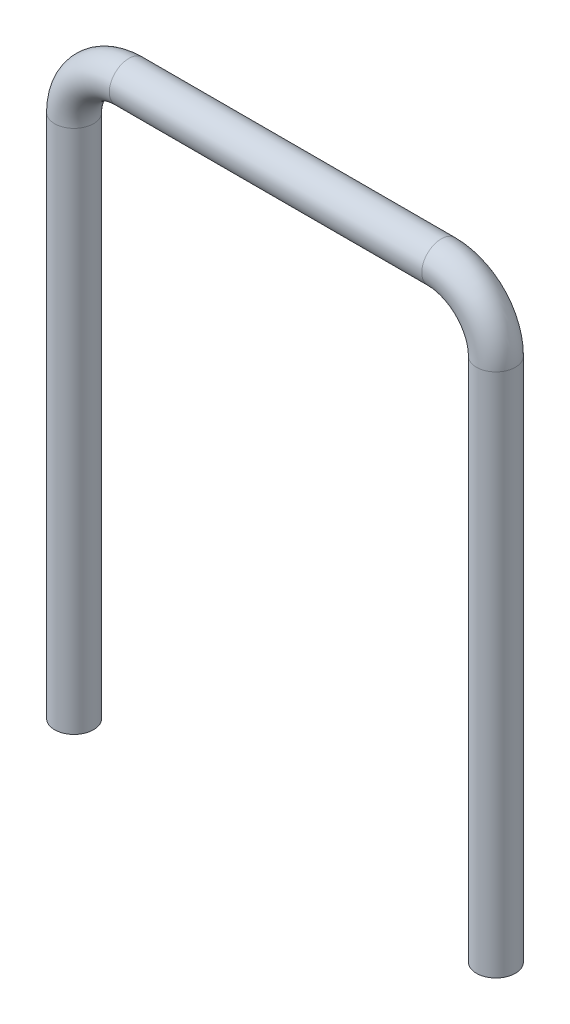
ISO-10303-21;
HEADER;
FILE_DESCRIPTION(('STEP AP214'),'2;1');
FILE_NAME('part.step','',(''),(''),'','','');
FILE_SCHEMA(('AUTOMOTIVE_DESIGN { 1 0 10303 214 1 1 1 1 }'));
ENDSEC;
DATA;
#1=APPLICATION_CONTEXT('core data for automotive mechanical design processes');
#2=APPLICATION_PROTOCOL_DEFINITION('international standard','automotive_design',2000,#1);
#3=PRODUCT_CONTEXT('',#1,'mechanical');
#4=PRODUCT('Part','Part','',(#3));
#5=PRODUCT_RELATED_PRODUCT_CATEGORY('part','',(#4));
#6=PRODUCT_DEFINITION_FORMATION('','',#4);
#7=PRODUCT_DEFINITION_CONTEXT('part definition',#1,'design');
#8=PRODUCT_DEFINITION('design','',#6,#7);
#9=PRODUCT_DEFINITION_SHAPE('','',#8);
#10=(LENGTH_UNIT() NAMED_UNIT(*) SI_UNIT(.MILLI.,.METRE.));
#11=(NAMED_UNIT(*) PLANE_ANGLE_UNIT() SI_UNIT($,.RADIAN.));
#12=(NAMED_UNIT(*) SI_UNIT($,.STERADIAN.) SOLID_ANGLE_UNIT());
#13=UNCERTAINTY_MEASURE_WITH_UNIT(LENGTH_MEASURE(1.E-05),#10,'distance_accuracy_value','');
#14=(GEOMETRIC_REPRESENTATION_CONTEXT(3) GLOBAL_UNCERTAINTY_ASSIGNED_CONTEXT((#13)) GLOBAL_UNIT_ASSIGNED_CONTEXT((#10,
#11,#12)) REPRESENTATION_CONTEXT('',''));
#15=CARTESIAN_POINT('',(0.,0.,0.));
#16=DIRECTION('',(0.,0.,1.));
#17=DIRECTION('',(1.,0.,0.));
#18=AXIS2_PLACEMENT_3D('',#15,#16,#17);
#19=CARTESIAN_POINT('',(0.,0.,0.));
#20=DIRECTION('',(0.,1.,0.));
#21=DIRECTION('',(0.,0.,1.));
#22=AXIS2_PLACEMENT_3D('',#19,#20,#21);
#23=PLANE('',#22);
#24=CARTESIAN_POINT('',(0.,0.,0.));
#25=DIRECTION('',(0.,1.,0.));
#26=DIRECTION('',(0.,0.,1.));
#27=AXIS2_PLACEMENT_3D('',#24,#25,#26);
#28=CIRCLE('',#27,0.3556);
#29=CARTESIAN_POINT('',(0.,0.,0.3556));
#30=VERTEX_POINT('',#29);
#31=EDGE_CURVE('E54',#30,#30,#28,.T.);
#32=ORIENTED_EDGE('',*,*,#31,.F.);
#33=EDGE_LOOP('',(#32));
#34=FACE_BOUND('',#33,.T.);
#35=ADVANCED_FACE('F32',(#34),#23,.F.);
#36=CARTESIAN_POINT('',(7.7112,0.,0.));
#37=DIRECTION('',(0.,-1.,0.));
#38=DIRECTION('',(0.,0.,1.));
#39=AXIS2_PLACEMENT_3D('',#36,#37,#38);
#40=PLANE('',#39);
#41=CARTESIAN_POINT('',(7.7112,0.,0.));
#42=DIRECTION('',(0.,-1.,0.));
#43=DIRECTION('',(0.,0.,1.));
#44=AXIS2_PLACEMENT_3D('',#41,#42,#43);
#45=CIRCLE('',#44,0.3556);
#46=CARTESIAN_POINT('',(7.7112,0.,0.3556));
#47=VERTEX_POINT('',#46);
#48=EDGE_CURVE('E10',#47,#47,#45,.T.);
#49=ORIENTED_EDGE('',*,*,#48,.T.);
#50=EDGE_LOOP('',(#49));
#51=FACE_BOUND('',#50,.T.);
#52=ADVANCED_FACE('F61',(#51),#40,.T.);
#53=CARTESIAN_POINT('',(0.,0.,0.));
#54=DIRECTION('',(0.,1.,0.));
#55=DIRECTION('',(-1.,0.,0.));
#56=AXIS2_PLACEMENT_3D('',#53,#54,#55);
#57=CYLINDRICAL_SURFACE('',#56,0.3556);
#58=CARTESIAN_POINT('',(0.,9.5944,0.));
#59=DIRECTION('',(0.,1.,0.));
#60=DIRECTION('',(0.,0.,1.));
#61=AXIS2_PLACEMENT_3D('',#58,#59,#60);
#62=CIRCLE('',#61,0.3556);
#63=CARTESIAN_POINT('',(-0.3556,9.5944,0.));
#64=VERTEX_POINT('',#63);
#65=EDGE_CURVE('E51',#64,#64,#62,.T.);
#66=ORIENTED_EDGE('',*,*,#65,.F.);
#67=EDGE_LOOP('',(#66));
#68=FACE_BOUND('',#67,.T.);
#69=ORIENTED_EDGE('',*,*,#31,.T.);
#70=EDGE_LOOP('',(#69));
#71=FACE_BOUND('',#70,.T.);
#72=ADVANCED_FACE('F58',(#68,#71),#57,.T.);
#73=CARTESIAN_POINT('',(0.999999999999998,9.5944,0.));
#74=DIRECTION('',(0.,0.,-1.));
#75=DIRECTION('',(-1.,0.,0.));
#76=AXIS2_PLACEMENT_3D('',#73,#74,#75);
#77=TOROIDAL_SURFACE('',#76,0.999999999999999,0.3556);
#78=CARTESIAN_POINT('',(0.999999999999998,10.5944,0.));
#79=DIRECTION('',(1.,0.,0.));
#80=DIRECTION('',(0.,0.,1.));
#81=AXIS2_PLACEMENT_3D('',#78,#79,#80);
#82=CIRCLE('',#81,0.3556);
#83=CARTESIAN_POINT('',(0.999999999999998,10.95,0.));
#84=VERTEX_POINT('',#83);
#85=EDGE_CURVE('E46',#84,#84,#82,.T.);
#86=CARTESIAN_POINT('',(0.999999999999998,9.5944,0.));
#87=DIRECTION('',(0.,0.,-1.));
#88=DIRECTION('',(-1.,0.,0.));
#89=AXIS2_PLACEMENT_3D('',#86,#87,#88);
#90=CIRCLE('',#89,1.3556);
#91=EDGE_CURVE('',#64,#84,#90,.T.);
#92=ORIENTED_EDGE('',*,*,#65,.T.);
#93=ORIENTED_EDGE('',*,*,#85,.F.);
#94=ORIENTED_EDGE('',*,*,#91,.T.);
#95=ORIENTED_EDGE('',*,*,#91,.F.);
#96=EDGE_LOOP('',(#92,#94,#93,#95));
#97=FACE_BOUND('',#96,.T.);
#98=ADVANCED_FACE('F79',(#97),#77,.T.);
#99=CARTESIAN_POINT('',(0.999999999999998,10.5944,0.));
#100=DIRECTION('',(1.,0.,0.));
#101=DIRECTION('',(0.,0.,-1.));
#102=AXIS2_PLACEMENT_3D('',#99,#100,#101);
#103=CYLINDRICAL_SURFACE('',#102,0.3556);
#104=CARTESIAN_POINT('',(6.7112,10.5944,0.));
#105=DIRECTION('',(1.,0.,0.));
#106=DIRECTION('',(0.,0.,1.));
#107=AXIS2_PLACEMENT_3D('',#104,#105,#106);
#108=CIRCLE('',#107,0.3556);
#109=CARTESIAN_POINT('',(6.7112,10.95,0.));
#110=VERTEX_POINT('',#109);
#111=EDGE_CURVE('E42',#110,#110,#108,.T.);
#112=ORIENTED_EDGE('',*,*,#111,.F.);
#113=EDGE_LOOP('',(#112));
#114=FACE_BOUND('',#113,.T.);
#115=ORIENTED_EDGE('',*,*,#85,.T.);
#116=EDGE_LOOP('',(#115));
#117=FACE_BOUND('',#116,.T.);
#118=ADVANCED_FACE('F73',(#114,#117),#103,.T.);
#119=CARTESIAN_POINT('',(6.7112,9.5944,0.));
#120=DIRECTION('',(0.,0.,-1.));
#121=DIRECTION('',(-1.,0.,0.));
#122=AXIS2_PLACEMENT_3D('',#119,#120,#121);
#123=TOROIDAL_SURFACE('',#122,0.999999999999999,0.3556);
#124=CARTESIAN_POINT('',(7.7112,9.5944,0.));
#125=DIRECTION('',(0.,-1.,0.));
#126=DIRECTION('',(0.,0.,1.));
#127=AXIS2_PLACEMENT_3D('',#124,#125,#126);
#128=CIRCLE('',#127,0.3556);
#129=CARTESIAN_POINT('',(8.0668,9.5944,0.));
#130=VERTEX_POINT('',#129);
#131=EDGE_CURVE('E38',#130,#130,#128,.T.);
#132=CARTESIAN_POINT('',(6.7112,9.5944,0.));
#133=DIRECTION('',(0.,0.,-1.));
#134=DIRECTION('',(-1.,0.,0.));
#135=AXIS2_PLACEMENT_3D('',#132,#133,#134);
#136=CIRCLE('',#135,1.3556);
#137=EDGE_CURVE('',#110,#130,#136,.T.);
#138=ORIENTED_EDGE('',*,*,#111,.T.);
#139=ORIENTED_EDGE('',*,*,#131,.F.);
#140=ORIENTED_EDGE('',*,*,#137,.T.);
#141=ORIENTED_EDGE('',*,*,#137,.F.);
#142=EDGE_LOOP('',(#138,#140,#139,#141));
#143=FACE_BOUND('',#142,.T.);
#144=ADVANCED_FACE('F67',(#143),#123,.T.);
#145=CARTESIAN_POINT('',(7.7112,9.5944,0.));
#146=DIRECTION('',(0.,-1.,0.));
#147=DIRECTION('',(0.,0.,-1.));
#148=AXIS2_PLACEMENT_3D('',#145,#146,#147);
#149=CYLINDRICAL_SURFACE('',#148,0.3556);
#150=ORIENTED_EDGE('',*,*,#48,.F.);
#151=EDGE_LOOP('',(#150));
#152=FACE_BOUND('',#151,.T.);
#153=ORIENTED_EDGE('',*,*,#131,.T.);
#154=EDGE_LOOP('',(#153));
#155=FACE_BOUND('',#154,.T.);
#156=ADVANCED_FACE('F65',(#152,#155),#149,.T.);
#157=CLOSED_SHELL('',(#35,#52,#72,#98,#118,#144,#156));
#158=MANIFOLD_SOLID_BREP('B2',#157);
#159=ADVANCED_BREP_SHAPE_REPRESENTATION('',(#18,#158),#14);
#160=SHAPE_DEFINITION_REPRESENTATION(#9,#159);
ENDSEC;
END-ISO-10303-21;
